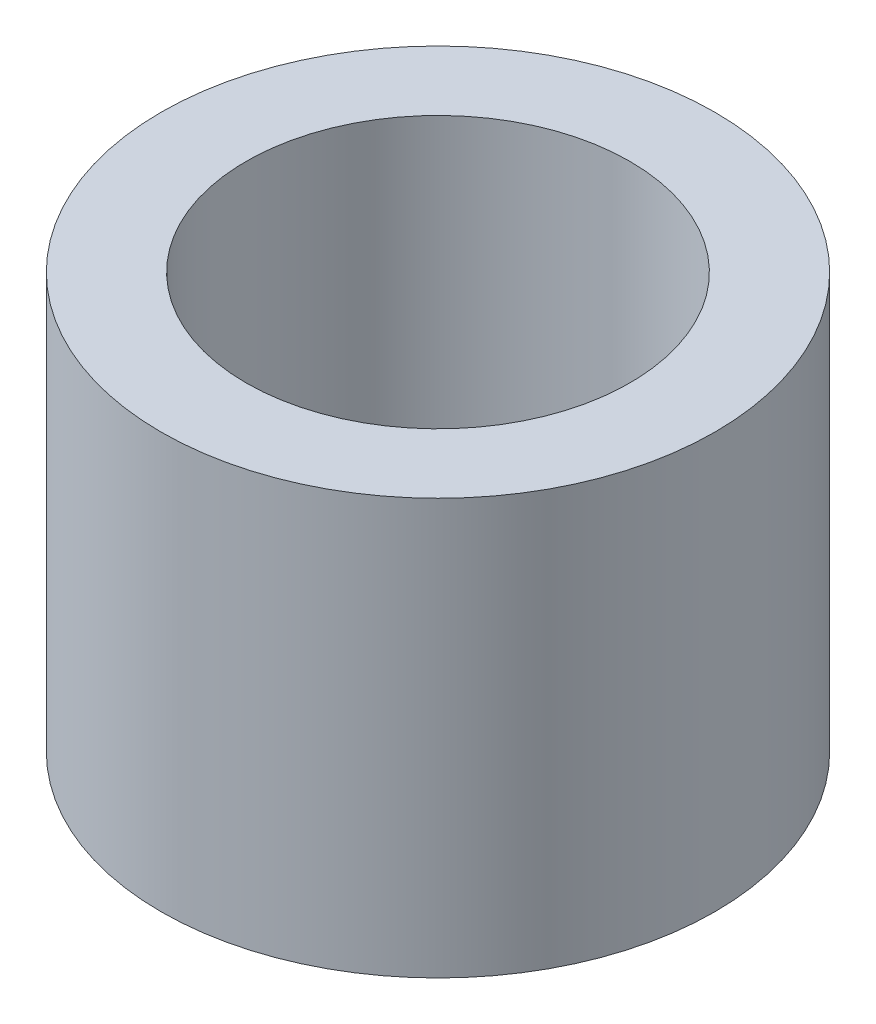
ISO-10303-21;
HEADER;
FILE_DESCRIPTION(('STEP AP214'),'2;1');
FILE_NAME('part.step','',(''),(''),'','','');
FILE_SCHEMA(('AUTOMOTIVE_DESIGN { 1 0 10303 214 1 1 1 1 }'));
ENDSEC;
DATA;
#1=APPLICATION_CONTEXT('core data for automotive mechanical design processes');
#2=APPLICATION_PROTOCOL_DEFINITION('international standard','automotive_design',2000,#1);
#3=PRODUCT_CONTEXT('',#1,'mechanical');
#4=PRODUCT('Part','Part','',(#3));
#5=PRODUCT_RELATED_PRODUCT_CATEGORY('part','',(#4));
#6=PRODUCT_DEFINITION_FORMATION('','',#4);
#7=PRODUCT_DEFINITION_CONTEXT('part definition',#1,'design');
#8=PRODUCT_DEFINITION('design','',#6,#7);
#9=PRODUCT_DEFINITION_SHAPE('','',#8);
#10=(LENGTH_UNIT() NAMED_UNIT(*) SI_UNIT(.MILLI.,.METRE.));
#11=(NAMED_UNIT(*) PLANE_ANGLE_UNIT() SI_UNIT($,.RADIAN.));
#12=(NAMED_UNIT(*) SI_UNIT($,.STERADIAN.) SOLID_ANGLE_UNIT());
#13=UNCERTAINTY_MEASURE_WITH_UNIT(LENGTH_MEASURE(1.E-05),#10,'distance_accuracy_value','');
#14=(GEOMETRIC_REPRESENTATION_CONTEXT(3) GLOBAL_UNCERTAINTY_ASSIGNED_CONTEXT((#13)) GLOBAL_UNIT_ASSIGNED_CONTEXT((#10,
#11,#12)) REPRESENTATION_CONTEXT('',''));
#15=CARTESIAN_POINT('',(0.,0.,0.));
#16=DIRECTION('',(0.,0.,1.));
#17=DIRECTION('',(1.,0.,0.));
#18=AXIS2_PLACEMENT_3D('',#15,#16,#17);
#19=CARTESIAN_POINT('',(0.,4.7625,0.));
#20=DIRECTION('',(0.,1.,0.));
#21=DIRECTION('',(0.,0.,1.));
#22=AXIS2_PLACEMENT_3D('',#19,#20,#21);
#23=PLANE('',#22);
#24=CARTESIAN_POINT('',(0.,4.7625,0.));
#25=DIRECTION('',(0.,1.,0.));
#26=DIRECTION('',(0.,0.,1.));
#27=AXIS2_PLACEMENT_3D('',#24,#25,#26);
#28=CIRCLE('',#27,3.175);
#29=CARTESIAN_POINT('',(0.,4.7625,-3.175));
#30=VERTEX_POINT('',#29);
#31=EDGE_CURVE('E10',#30,#30,#28,.T.);
#32=ORIENTED_EDGE('',*,*,#31,.T.);
#33=EDGE_LOOP('',(#32));
#34=FACE_BOUND('',#33,.T.);
#35=CARTESIAN_POINT('',(0.,4.7625,0.));
#36=DIRECTION('',(0.,1.,0.));
#37=DIRECTION('',(0.,0.,1.));
#38=AXIS2_PLACEMENT_3D('',#35,#36,#37);
#39=CIRCLE('',#38,2.2);
#40=CARTESIAN_POINT('',(0.,4.7625,-2.2));
#41=VERTEX_POINT('',#40);
#42=EDGE_CURVE('E42',#41,#41,#39,.T.);
#43=ORIENTED_EDGE('',*,*,#42,.F.);
#44=EDGE_LOOP('',(#43));
#45=FACE_BOUND('',#44,.T.);
#46=ADVANCED_FACE('F31',(#34,#45),#23,.T.);
#47=CARTESIAN_POINT('',(0.,0.,0.));
#48=DIRECTION('',(0.,1.,0.));
#49=DIRECTION('',(0.,0.,1.));
#50=AXIS2_PLACEMENT_3D('',#47,#48,#49);
#51=PLANE('',#50);
#52=CARTESIAN_POINT('',(0.,0.,0.));
#53=DIRECTION('',(0.,1.,0.));
#54=DIRECTION('',(0.,0.,1.));
#55=AXIS2_PLACEMENT_3D('',#52,#53,#54);
#56=CIRCLE('',#55,3.175);
#57=CARTESIAN_POINT('',(0.,0.,-3.175));
#58=VERTEX_POINT('',#57);
#59=EDGE_CURVE('E35',#58,#58,#56,.T.);
#60=ORIENTED_EDGE('',*,*,#59,.F.);
#61=EDGE_LOOP('',(#60));
#62=FACE_BOUND('',#61,.T.);
#63=CARTESIAN_POINT('',(0.,0.,0.));
#64=DIRECTION('',(0.,1.,0.));
#65=DIRECTION('',(0.,0.,1.));
#66=AXIS2_PLACEMENT_3D('',#63,#64,#65);
#67=CIRCLE('',#66,2.2);
#68=CARTESIAN_POINT('',(0.,0.,-2.2));
#69=VERTEX_POINT('',#68);
#70=EDGE_CURVE('E44',#69,#69,#67,.T.);
#71=ORIENTED_EDGE('',*,*,#70,.T.);
#72=EDGE_LOOP('',(#71));
#73=FACE_BOUND('',#72,.T.);
#74=ADVANCED_FACE('F54',(#62,#73),#51,.F.);
#75=CARTESIAN_POINT('',(0.,4.7625,0.));
#76=DIRECTION('',(0.,-1.,0.));
#77=DIRECTION('',(0.,0.,-1.));
#78=AXIS2_PLACEMENT_3D('',#75,#76,#77);
#79=CYLINDRICAL_SURFACE('',#78,3.175);
#80=CARTESIAN_POINT('',(0.,4.7625,-3.175));
#81=CARTESIAN_POINT('',(0.,4.712890625,-3.175));
#82=CARTESIAN_POINT('',(0.,4.66328125,-3.175));
#83=CARTESIAN_POINT('',(0.,4.5640625,-3.175));
#84=CARTESIAN_POINT('',(0.,4.514453125,-3.175));
#85=CARTESIAN_POINT('',(0.,4.415234375,-3.175));
#86=CARTESIAN_POINT('',(0.,4.365625,-3.175));
#87=CARTESIAN_POINT('',(0.,4.26640625,-3.175));
#88=CARTESIAN_POINT('',(0.,4.216796875,-3.175));
#89=CARTESIAN_POINT('',(0.,4.117578125,-3.175));
#90=CARTESIAN_POINT('',(0.,4.06796875,-3.175));
#91=CARTESIAN_POINT('',(0.,3.96875,-3.175));
#92=CARTESIAN_POINT('',(0.,3.919140625,-3.175));
#93=CARTESIAN_POINT('',(0.,3.819921875,-3.175));
#94=CARTESIAN_POINT('',(0.,3.7703125,-3.175));
#95=CARTESIAN_POINT('',(0.,3.67109375,-3.175));
#96=CARTESIAN_POINT('',(0.,3.621484375,-3.175));
#97=CARTESIAN_POINT('',(0.,3.522265625,-3.175));
#98=CARTESIAN_POINT('',(0.,3.47265625,-3.175));
#99=CARTESIAN_POINT('',(0.,3.3734375,-3.175));
#100=CARTESIAN_POINT('',(0.,3.323828125,-3.175));
#101=CARTESIAN_POINT('',(0.,3.224609375,-3.175));
#102=CARTESIAN_POINT('',(0.,3.175,-3.175));
#103=CARTESIAN_POINT('',(0.,3.07578125,-3.175));
#104=CARTESIAN_POINT('',(0.,3.026171875,-3.175));
#105=CARTESIAN_POINT('',(0.,2.926953125,-3.175));
#106=CARTESIAN_POINT('',(0.,2.87734375,-3.175));
#107=CARTESIAN_POINT('',(0.,2.778125,-3.175));
#108=CARTESIAN_POINT('',(0.,2.728515625,-3.175));
#109=CARTESIAN_POINT('',(0.,2.629296875,-3.175));
#110=CARTESIAN_POINT('',(0.,2.5796875,-3.175));
#111=CARTESIAN_POINT('',(0.,2.48046875,-3.175));
#112=CARTESIAN_POINT('',(0.,2.430859375,-3.175));
#113=CARTESIAN_POINT('',(0.,2.331640625,-3.175));
#114=CARTESIAN_POINT('',(0.,2.28203125,-3.175));
#115=CARTESIAN_POINT('',(0.,2.1828125,-3.175));
#116=CARTESIAN_POINT('',(0.,2.133203125,-3.175));
#117=CARTESIAN_POINT('',(0.,2.033984375,-3.175));
#118=CARTESIAN_POINT('',(0.,1.984375,-3.175));
#119=CARTESIAN_POINT('',(0.,1.88515625,-3.175));
#120=CARTESIAN_POINT('',(0.,1.835546875,-3.175));
#121=CARTESIAN_POINT('',(0.,1.736328125,-3.175));
#122=CARTESIAN_POINT('',(0.,1.68671875,-3.175));
#123=CARTESIAN_POINT('',(0.,1.5875,-3.175));
#124=CARTESIAN_POINT('',(0.,1.537890625,-3.175));
#125=CARTESIAN_POINT('',(0.,1.438671875,-3.175));
#126=CARTESIAN_POINT('',(0.,1.3890625,-3.175));
#127=CARTESIAN_POINT('',(0.,1.28984375,-3.175));
#128=CARTESIAN_POINT('',(0.,1.240234375,-3.175));
#129=CARTESIAN_POINT('',(0.,1.141015625,-3.175));
#130=CARTESIAN_POINT('',(0.,1.09140625,-3.175));
#131=CARTESIAN_POINT('',(0.,0.9921875,-3.175));
#132=CARTESIAN_POINT('',(0.,0.942578125,-3.175));
#133=CARTESIAN_POINT('',(0.,0.843359375,-3.175));
#134=CARTESIAN_POINT('',(0.,0.79375,-3.175));
#135=CARTESIAN_POINT('',(0.,0.69453125,-3.175));
#136=CARTESIAN_POINT('',(0.,0.644921875,-3.175));
#137=CARTESIAN_POINT('',(0.,0.545703125,-3.175));
#138=CARTESIAN_POINT('',(0.,0.49609375,-3.175));
#139=CARTESIAN_POINT('',(0.,0.396875,-3.175));
#140=CARTESIAN_POINT('',(0.,0.347265625,-3.175));
#141=CARTESIAN_POINT('',(0.,0.248046875,-3.175));
#142=CARTESIAN_POINT('',(0.,0.1984375,-3.175));
#143=CARTESIAN_POINT('',(0.,0.09921875,-3.175));
#144=CARTESIAN_POINT('',(0.,0.049609375,-3.175));
#145=CARTESIAN_POINT('',(0.,0.,-3.175));
#146=B_SPLINE_CURVE_WITH_KNOTS('',3,(#80,#81,#82,#83,#84,#85,#86,#87,#88,#89,#90,#91,#92,#93,
#94,#95,#96,#97,#98,#99,#100,#101,#102,#103,#104,#105,#106,#107,#108,#109,#110,#111,#112,#113,
#114,#115,#116,#117,#118,#119,#120,#121,#122,#123,#124,#125,#126,#127,#128,#129,#130,#131,#132,
#133,#134,#135,#136,#137,#138,#139,#140,#141,#142,#143,#144,#145),.UNSPECIFIED.,.F.,.F.,(4,2,2,
2,2,2,2,2,2,2,2,2,2,2,2,2,2,2,2,2,2,2,2,2,2,2,2,2,2,2,2,2,4),(0.,0.148828124999999,
0.297656249999999,0.446484374999999,0.595312499999999,0.744140625,0.89296875,1.041796875,
1.190625,1.339453125,1.48828125,1.637109375,1.7859375,1.934765625,2.08359375,2.232421875,
2.38125,2.530078125,2.67890625,2.827734375,2.9765625,3.125390625,3.27421875,3.423046875,
3.571875,3.720703125,3.86953125,4.018359375,4.1671875,4.316015625,4.46484375,4.613671875,
4.7625),.UNSPECIFIED.);
#147=EDGE_CURVE('BSEAM33',#30,#58,#146,.T.);
#148=ORIENTED_EDGE('',*,*,#31,.F.);
#149=ORIENTED_EDGE('',*,*,#59,.T.);
#150=ORIENTED_EDGE('',*,*,#147,.T.);
#151=ORIENTED_EDGE('',*,*,#147,.F.);
#152=EDGE_LOOP('',(#148,#150,#149,#151));
#153=FACE_BOUND('',#152,.T.);
#154=ADVANCED_FACE('F33',(#153),#79,.T.);
#155=CARTESIAN_POINT('',(0.,4.7625,0.));
#156=DIRECTION('',(0.,-1.,0.));
#157=DIRECTION('',(0.,0.,-1.));
#158=AXIS2_PLACEMENT_3D('',#155,#156,#157);
#159=CYLINDRICAL_SURFACE('',#158,2.2);
#160=CARTESIAN_POINT('',(0.,4.7625,-2.2));
#161=CARTESIAN_POINT('',(0.,4.712890625,-2.2));
#162=CARTESIAN_POINT('',(0.,4.66328125,-2.2));
#163=CARTESIAN_POINT('',(0.,4.5640625,-2.2));
#164=CARTESIAN_POINT('',(0.,4.514453125,-2.2));
#165=CARTESIAN_POINT('',(0.,4.415234375,-2.2));
#166=CARTESIAN_POINT('',(0.,4.365625,-2.2));
#167=CARTESIAN_POINT('',(0.,4.26640625,-2.2));
#168=CARTESIAN_POINT('',(0.,4.216796875,-2.2));
#169=CARTESIAN_POINT('',(0.,4.117578125,-2.2));
#170=CARTESIAN_POINT('',(0.,4.06796875,-2.2));
#171=CARTESIAN_POINT('',(0.,3.96875,-2.2));
#172=CARTESIAN_POINT('',(0.,3.919140625,-2.2));
#173=CARTESIAN_POINT('',(0.,3.819921875,-2.2));
#174=CARTESIAN_POINT('',(0.,3.7703125,-2.2));
#175=CARTESIAN_POINT('',(0.,3.67109375,-2.2));
#176=CARTESIAN_POINT('',(0.,3.621484375,-2.2));
#177=CARTESIAN_POINT('',(0.,3.522265625,-2.2));
#178=CARTESIAN_POINT('',(0.,3.47265625,-2.2));
#179=CARTESIAN_POINT('',(0.,3.3734375,-2.2));
#180=CARTESIAN_POINT('',(0.,3.323828125,-2.2));
#181=CARTESIAN_POINT('',(0.,3.224609375,-2.2));
#182=CARTESIAN_POINT('',(0.,3.175,-2.2));
#183=CARTESIAN_POINT('',(0.,3.07578125,-2.2));
#184=CARTESIAN_POINT('',(0.,3.026171875,-2.2));
#185=CARTESIAN_POINT('',(0.,2.926953125,-2.2));
#186=CARTESIAN_POINT('',(0.,2.87734375,-2.2));
#187=CARTESIAN_POINT('',(0.,2.778125,-2.2));
#188=CARTESIAN_POINT('',(0.,2.728515625,-2.2));
#189=CARTESIAN_POINT('',(0.,2.629296875,-2.2));
#190=CARTESIAN_POINT('',(0.,2.5796875,-2.2));
#191=CARTESIAN_POINT('',(0.,2.48046875,-2.2));
#192=CARTESIAN_POINT('',(0.,2.430859375,-2.2));
#193=CARTESIAN_POINT('',(0.,2.331640625,-2.2));
#194=CARTESIAN_POINT('',(0.,2.28203125,-2.2));
#195=CARTESIAN_POINT('',(0.,2.1828125,-2.2));
#196=CARTESIAN_POINT('',(0.,2.133203125,-2.2));
#197=CARTESIAN_POINT('',(0.,2.033984375,-2.2));
#198=CARTESIAN_POINT('',(0.,1.984375,-2.2));
#199=CARTESIAN_POINT('',(0.,1.88515625,-2.2));
#200=CARTESIAN_POINT('',(0.,1.835546875,-2.2));
#201=CARTESIAN_POINT('',(0.,1.736328125,-2.2));
#202=CARTESIAN_POINT('',(0.,1.68671875,-2.2));
#203=CARTESIAN_POINT('',(0.,1.5875,-2.2));
#204=CARTESIAN_POINT('',(0.,1.537890625,-2.2));
#205=CARTESIAN_POINT('',(0.,1.438671875,-2.2));
#206=CARTESIAN_POINT('',(0.,1.3890625,-2.2));
#207=CARTESIAN_POINT('',(0.,1.28984375,-2.2));
#208=CARTESIAN_POINT('',(0.,1.240234375,-2.2));
#209=CARTESIAN_POINT('',(0.,1.141015625,-2.2));
#210=CARTESIAN_POINT('',(0.,1.09140625,-2.2));
#211=CARTESIAN_POINT('',(0.,0.992187499999999,-2.2));
#212=CARTESIAN_POINT('',(0.,0.942578124999999,-2.2));
#213=CARTESIAN_POINT('',(0.,0.843359375,-2.2));
#214=CARTESIAN_POINT('',(0.,0.79375,-2.2));
#215=CARTESIAN_POINT('',(0.,0.69453125,-2.2));
#216=CARTESIAN_POINT('',(0.,0.644921875,-2.2));
#217=CARTESIAN_POINT('',(0.,0.545703125,-2.2));
#218=CARTESIAN_POINT('',(0.,0.49609375,-2.2));
#219=CARTESIAN_POINT('',(0.,0.396875,-2.2));
#220=CARTESIAN_POINT('',(0.,0.347265625,-2.2));
#221=CARTESIAN_POINT('',(0.,0.248046875,-2.2));
#222=CARTESIAN_POINT('',(0.,0.1984375,-2.2));
#223=CARTESIAN_POINT('',(0.,0.09921875,-2.2));
#224=CARTESIAN_POINT('',(0.,0.049609375,-2.2));
#225=CARTESIAN_POINT('',(0.,0.,-2.2));
#226=B_SPLINE_CURVE_WITH_KNOTS('',3,(#160,#161,#162,#163,#164,#165,#166,#167,#168,#169,#170,
#171,#172,#173,#174,#175,#176,#177,#178,#179,#180,#181,#182,#183,#184,#185,#186,#187,#188,#189,
#190,#191,#192,#193,#194,#195,#196,#197,#198,#199,#200,#201,#202,#203,#204,#205,#206,#207,#208,
#209,#210,#211,#212,#213,#214,#215,#216,#217,#218,#219,#220,#221,#222,#223,#224,#225),
.UNSPECIFIED.,.F.,.F.,(4,2,2,2,2,2,2,2,2,2,2,2,2,2,2,2,2,2,2,2,2,2,2,2,2,2,2,2,2,2,2,2,4),(0.,
0.148828125,0.29765625,0.446484375,0.5953125,0.744140625,0.892968750000001,1.041796875,1.190625,
1.339453125,1.48828125,1.637109375,1.7859375,1.934765625,2.08359375,2.232421875,2.38125,
2.530078125,2.67890625,2.827734375,2.9765625,3.125390625,3.27421875,3.423046875,3.571875,
3.720703125,3.86953125,4.018359375,4.1671875,4.316015625,4.46484375,4.613671875,4.7625),.UNSPECIFIED.);
#227=EDGE_CURVE('BSEAM50',#41,#69,#226,.T.);
#228=ORIENTED_EDGE('',*,*,#42,.T.);
#229=ORIENTED_EDGE('',*,*,#70,.F.);
#230=ORIENTED_EDGE('',*,*,#227,.T.);
#231=ORIENTED_EDGE('',*,*,#227,.F.);
#232=EDGE_LOOP('',(#228,#230,#229,#231));
#233=FACE_BOUND('',#232,.T.);
#234=ADVANCED_FACE('F50',(#233),#159,.F.);
#235=CLOSED_SHELL('',(#46,#74,#154,#234));
#236=MANIFOLD_SOLID_BREP('B2',#235);
#237=ADVANCED_BREP_SHAPE_REPRESENTATION('',(#18,#236),#14);
#238=SHAPE_DEFINITION_REPRESENTATION(#9,#237);
ENDSEC;
END-ISO-10303-21;
